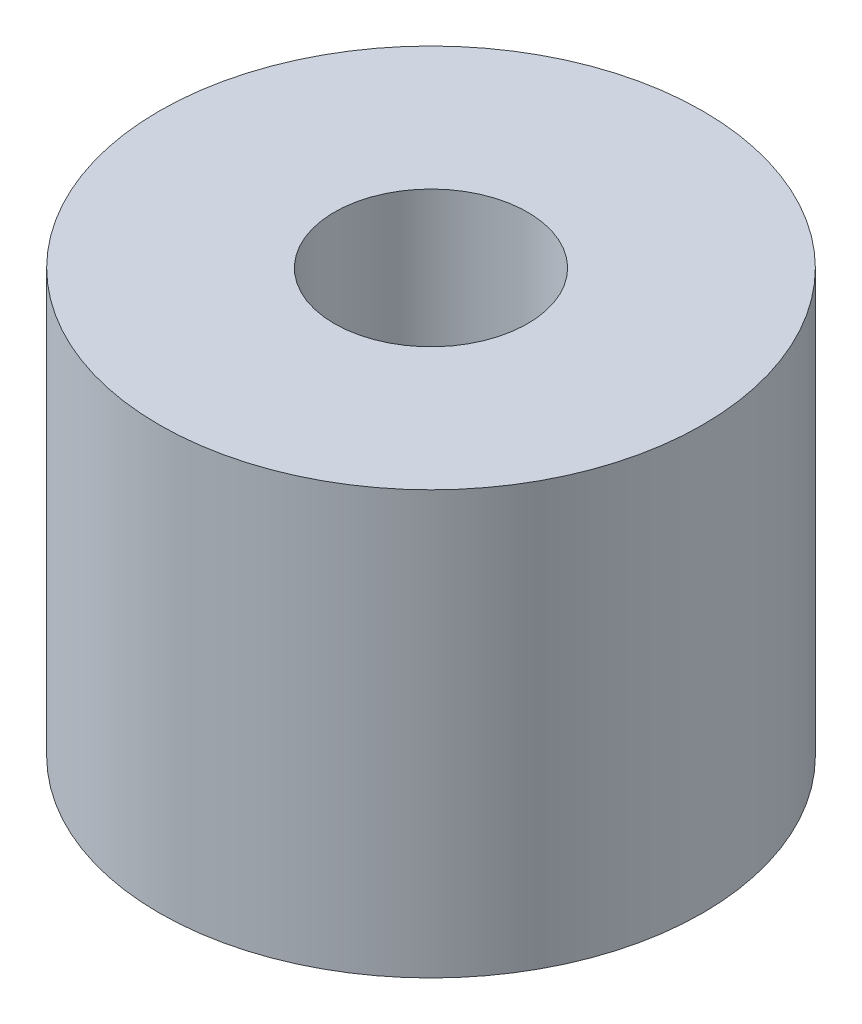
ISO-10303-21;
HEADER;
FILE_DESCRIPTION(('STEP AP214'),'2;1');
FILE_NAME('part.step','',(''),(''),'','','');
FILE_SCHEMA(('AUTOMOTIVE_DESIGN { 1 0 10303 214 1 1 1 1 }'));
ENDSEC;
DATA;
#1=APPLICATION_CONTEXT('core data for automotive mechanical design processes');
#2=APPLICATION_PROTOCOL_DEFINITION('international standard','automotive_design',2000,#1);
#3=PRODUCT_CONTEXT('',#1,'mechanical');
#4=PRODUCT('Part','Part','',(#3));
#5=PRODUCT_RELATED_PRODUCT_CATEGORY('part','',(#4));
#6=PRODUCT_DEFINITION_FORMATION('','',#4);
#7=PRODUCT_DEFINITION_CONTEXT('part definition',#1,'design');
#8=PRODUCT_DEFINITION('design','',#6,#7);
#9=PRODUCT_DEFINITION_SHAPE('','',#8);
#10=(LENGTH_UNIT() NAMED_UNIT(*) SI_UNIT(.MILLI.,.METRE.));
#11=(NAMED_UNIT(*) PLANE_ANGLE_UNIT() SI_UNIT($,.RADIAN.));
#12=(NAMED_UNIT(*) SI_UNIT($,.STERADIAN.) SOLID_ANGLE_UNIT());
#13=UNCERTAINTY_MEASURE_WITH_UNIT(LENGTH_MEASURE(1.E-05),#10,'distance_accuracy_value','');
#14=(GEOMETRIC_REPRESENTATION_CONTEXT(3) GLOBAL_UNCERTAINTY_ASSIGNED_CONTEXT((#13)) GLOBAL_UNIT_ASSIGNED_CONTEXT((#10,
#11,#12)) REPRESENTATION_CONTEXT('',''));
#15=CARTESIAN_POINT('',(0.,0.,0.));
#16=DIRECTION('',(0.,0.,1.));
#17=DIRECTION('',(1.,0.,0.));
#18=AXIS2_PLACEMENT_3D('',#15,#16,#17);
#19=CARTESIAN_POINT('',(0.,7.,0.));
#20=DIRECTION('',(0.,1.,0.));
#21=DIRECTION('',(0.,0.,1.));
#22=AXIS2_PLACEMENT_3D('',#19,#20,#21);
#23=PLANE('',#22);
#24=CARTESIAN_POINT('',(0.,7.,0.));
#25=DIRECTION('',(0.,1.,0.));
#26=DIRECTION('',(0.,0.,1.));
#27=AXIS2_PLACEMENT_3D('',#24,#25,#26);
#28=CIRCLE('',#27,4.5);
#29=CARTESIAN_POINT('',(0.,7.,4.5));
#30=VERTEX_POINT('',#29);
#31=EDGE_CURVE('E10',#30,#30,#28,.T.);
#32=ORIENTED_EDGE('',*,*,#31,.T.);
#33=EDGE_LOOP('',(#32));
#34=FACE_BOUND('',#33,.T.);
#35=CARTESIAN_POINT('',(0.,7.,0.));
#36=DIRECTION('',(0.,1.,0.));
#37=DIRECTION('',(0.,0.,1.));
#38=AXIS2_PLACEMENT_3D('',#35,#36,#37);
#39=CIRCLE('',#38,1.6);
#40=CARTESIAN_POINT('',(0.,7.,1.6));
#41=VERTEX_POINT('',#40);
#42=EDGE_CURVE('E48',#41,#41,#39,.T.);
#43=ORIENTED_EDGE('',*,*,#42,.F.);
#44=EDGE_LOOP('',(#43));
#45=FACE_BOUND('',#44,.T.);
#46=ADVANCED_FACE('F37',(#34,#45),#23,.T.);
#47=CARTESIAN_POINT('',(0.,0.,0.));
#48=DIRECTION('',(0.,1.,0.));
#49=DIRECTION('',(0.,0.,1.));
#50=AXIS2_PLACEMENT_3D('',#47,#48,#49);
#51=PLANE('',#50);
#52=CARTESIAN_POINT('',(0.,0.,0.));
#53=DIRECTION('',(0.,1.,0.));
#54=DIRECTION('',(0.,0.,1.));
#55=AXIS2_PLACEMENT_3D('',#52,#53,#54);
#56=CIRCLE('',#55,4.5);
#57=CARTESIAN_POINT('',(0.,0.,4.5));
#58=VERTEX_POINT('',#57);
#59=EDGE_CURVE('E41',#58,#58,#56,.T.);
#60=ORIENTED_EDGE('',*,*,#59,.F.);
#61=EDGE_LOOP('',(#60));
#62=FACE_BOUND('',#61,.T.);
#63=CARTESIAN_POINT('',(0.,0.,0.));
#64=DIRECTION('',(0.,1.,0.));
#65=DIRECTION('',(0.,0.,1.));
#66=AXIS2_PLACEMENT_3D('',#63,#64,#65);
#67=CIRCLE('',#66,1.6);
#68=CARTESIAN_POINT('',(0.,0.,1.6));
#69=VERTEX_POINT('',#68);
#70=EDGE_CURVE('E50',#69,#69,#67,.T.);
#71=ORIENTED_EDGE('',*,*,#70,.T.);
#72=EDGE_LOOP('',(#71));
#73=FACE_BOUND('',#72,.T.);
#74=ADVANCED_FACE('F60',(#62,#73),#51,.F.);
#75=CARTESIAN_POINT('',(0.,7.,0.));
#76=DIRECTION('',(0.,-1.,0.));
#77=DIRECTION('',(0.,0.,-1.));
#78=AXIS2_PLACEMENT_3D('',#75,#76,#77);
#79=CYLINDRICAL_SURFACE('',#78,4.5);
#80=ORIENTED_EDGE('',*,*,#31,.F.);
#81=EDGE_LOOP('',(#80));
#82=FACE_BOUND('',#81,.T.);
#83=ORIENTED_EDGE('',*,*,#59,.T.);
#84=EDGE_LOOP('',(#83));
#85=FACE_BOUND('',#84,.T.);
#86=ADVANCED_FACE('F39',(#82,#85),#79,.T.);
#87=CARTESIAN_POINT('',(0.,7.,0.));
#88=DIRECTION('',(0.,-1.,0.));
#89=DIRECTION('',(0.,0.,-1.));
#90=AXIS2_PLACEMENT_3D('',#87,#88,#89);
#91=CYLINDRICAL_SURFACE('',#90,1.6);
#92=ORIENTED_EDGE('',*,*,#42,.T.);
#93=EDGE_LOOP('',(#92));
#94=FACE_BOUND('',#93,.T.);
#95=ORIENTED_EDGE('',*,*,#70,.F.);
#96=EDGE_LOOP('',(#95));
#97=FACE_BOUND('',#96,.T.);
#98=ADVANCED_FACE('F56',(#94,#97),#91,.F.);
#99=CLOSED_SHELL('',(#46,#74,#86,#98));
#100=MANIFOLD_SOLID_BREP('B2',#99);
#101=ADVANCED_BREP_SHAPE_REPRESENTATION('',(#18,#100),#14);
#102=SHAPE_DEFINITION_REPRESENTATION(#9,#101);
ENDSEC;
END-ISO-10303-21;
